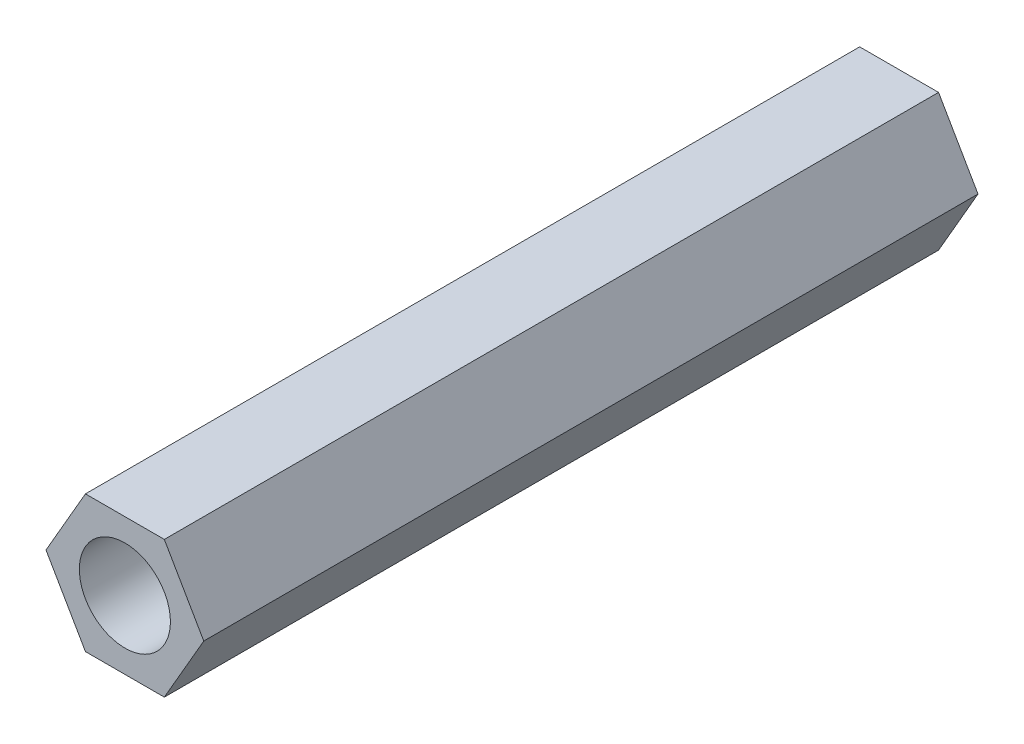
ISO-10303-21;
HEADER;
FILE_DESCRIPTION(('STEP AP214'),'2;1');
FILE_NAME('part.step','',(''),(''),'','','');
FILE_SCHEMA(('AUTOMOTIVE_DESIGN { 1 0 10303 214 1 1 1 1 }'));
ENDSEC;
DATA;
#1=APPLICATION_CONTEXT('core data for automotive mechanical design processes');
#2=APPLICATION_PROTOCOL_DEFINITION('international standard','automotive_design',2000,#1);
#3=PRODUCT_CONTEXT('',#1,'mechanical');
#4=PRODUCT('Part','Part','',(#3));
#5=PRODUCT_RELATED_PRODUCT_CATEGORY('part','',(#4));
#6=PRODUCT_DEFINITION_FORMATION('','',#4);
#7=PRODUCT_DEFINITION_CONTEXT('part definition',#1,'design');
#8=PRODUCT_DEFINITION('design','',#6,#7);
#9=PRODUCT_DEFINITION_SHAPE('','',#8);
#10=(LENGTH_UNIT() NAMED_UNIT(*) SI_UNIT(.MILLI.,.METRE.));
#11=(NAMED_UNIT(*) PLANE_ANGLE_UNIT() SI_UNIT($,.RADIAN.));
#12=(NAMED_UNIT(*) SI_UNIT($,.STERADIAN.) SOLID_ANGLE_UNIT());
#13=UNCERTAINTY_MEASURE_WITH_UNIT(LENGTH_MEASURE(1.E-05),#10,'distance_accuracy_value','');
#14=(GEOMETRIC_REPRESENTATION_CONTEXT(3) GLOBAL_UNCERTAINTY_ASSIGNED_CONTEXT((#13)) GLOBAL_UNIT_ASSIGNED_CONTEXT((#10,
#11,#12)) REPRESENTATION_CONTEXT('',''));
#15=CARTESIAN_POINT('',(0.,0.,0.));
#16=DIRECTION('',(0.,0.,1.));
#17=DIRECTION('',(1.,0.,0.));
#18=AXIS2_PLACEMENT_3D('',#15,#16,#17);
#19=CARTESIAN_POINT('',(0.,0.,17.));
#20=DIRECTION('',(0.,0.,1.));
#21=DIRECTION('',(1.,0.,0.));
#22=AXIS2_PLACEMENT_3D('',#19,#20,#21);
#23=PLANE('',#22);
#24=DIRECTION('',(0.5,0.866025403784438,0.));
#25=VECTOR('',#24,1.);
#26=CARTESIAN_POINT('',(0.86602540378444,-1.5,17.));
#27=LINE('',#26,#25);
#28=CARTESIAN_POINT('',(0.86602540378444,-1.5,17.));
#29=VERTEX_POINT('',#28);
#30=CARTESIAN_POINT('',(1.73205080756888,0.,17.));
#31=VERTEX_POINT('',#30);
#32=EDGE_CURVE('E146',#29,#31,#27,.T.);
#33=ORIENTED_EDGE('',*,*,#32,.T.);
#34=DIRECTION('',(-0.5,0.866025403784438,0.));
#35=VECTOR('',#34,1.);
#36=CARTESIAN_POINT('',(1.73205080756888,0.,17.));
#37=LINE('',#36,#35);
#38=CARTESIAN_POINT('',(0.866025403784438,1.5,17.));
#39=VERTEX_POINT('',#38);
#40=EDGE_CURVE('E94',#31,#39,#37,.T.);
#41=ORIENTED_EDGE('',*,*,#40,.T.);
#42=DIRECTION('',(-1.,0.,0.));
#43=VECTOR('',#42,1.);
#44=CARTESIAN_POINT('',(0.866025403784438,1.5,17.));
#45=LINE('',#44,#43);
#46=CARTESIAN_POINT('',(-0.866025403784439,1.5,17.));
#47=VERTEX_POINT('',#46);
#48=EDGE_CURVE('E107',#39,#47,#45,.T.);
#49=ORIENTED_EDGE('',*,*,#48,.T.);
#50=DIRECTION('',(-0.5,-0.866025403784438,0.));
#51=VECTOR('',#50,1.);
#52=CARTESIAN_POINT('',(-0.866025403784439,1.5,17.));
#53=LINE('',#52,#51);
#54=CARTESIAN_POINT('',(-1.73205080756888,0.,17.));
#55=VERTEX_POINT('',#54);
#56=EDGE_CURVE('E101',#47,#55,#53,.T.);
#57=ORIENTED_EDGE('',*,*,#56,.T.);
#58=DIRECTION('',(0.5,-0.866025403784438,0.));
#59=VECTOR('',#58,1.);
#60=CARTESIAN_POINT('',(-1.73205080756888,0.,17.));
#61=LINE('',#60,#59);
#62=CARTESIAN_POINT('',(-0.866025403784439,-1.5,17.));
#63=VERTEX_POINT('',#62);
#64=EDGE_CURVE('E105',#55,#63,#61,.T.);
#65=ORIENTED_EDGE('',*,*,#64,.T.);
#66=DIRECTION('',(1.,0.,0.));
#67=VECTOR('',#66,1.);
#68=CARTESIAN_POINT('',(-0.866025403784439,-1.5,17.));
#69=LINE('',#68,#67);
#70=EDGE_CURVE('E57',#63,#29,#69,.T.);
#71=ORIENTED_EDGE('',*,*,#70,.T.);
#72=EDGE_LOOP('',(#33,#41,#49,#57,#65,#71));
#73=FACE_BOUND('',#72,.T.);
#74=CARTESIAN_POINT('',(0.,0.,17.));
#75=DIRECTION('',(0.,0.,1.));
#76=DIRECTION('',(1.,0.,0.));
#77=AXIS2_PLACEMENT_3D('',#74,#75,#76);
#78=CIRCLE('',#77,1.);
#79=CARTESIAN_POINT('',(1.,0.,17.));
#80=VERTEX_POINT('',#79);
#81=EDGE_CURVE('E134',#80,#80,#78,.T.);
#82=ORIENTED_EDGE('',*,*,#81,.F.);
#83=EDGE_LOOP('',(#82));
#84=FACE_BOUND('',#83,.T.);
#85=ADVANCED_FACE('F39',(#73,#84),#23,.T.);
#86=CARTESIAN_POINT('',(0.,0.,0.));
#87=DIRECTION('',(0.,0.,1.));
#88=DIRECTION('',(1.,0.,0.));
#89=AXIS2_PLACEMENT_3D('',#86,#87,#88);
#90=PLANE('',#89);
#91=DIRECTION('',(0.5,0.866025403784438,0.));
#92=VECTOR('',#91,1.);
#93=CARTESIAN_POINT('',(0.86602540378444,-1.5,0.));
#94=LINE('',#93,#92);
#95=CARTESIAN_POINT('',(0.86602540378444,-1.5,0.));
#96=VERTEX_POINT('',#95);
#97=CARTESIAN_POINT('',(1.73205080756888,0.,0.));
#98=VERTEX_POINT('',#97);
#99=EDGE_CURVE('E129',#96,#98,#94,.T.);
#100=ORIENTED_EDGE('',*,*,#99,.F.);
#101=DIRECTION('',(1.,0.,0.));
#102=VECTOR('',#101,1.);
#103=CARTESIAN_POINT('',(-0.866025403784439,-1.5,0.));
#104=LINE('',#103,#102);
#105=CARTESIAN_POINT('',(-0.866025403784439,-1.5,0.));
#106=VERTEX_POINT('',#105);
#107=EDGE_CURVE('E86',#106,#96,#104,.T.);
#108=ORIENTED_EDGE('',*,*,#107,.F.);
#109=DIRECTION('',(0.5,-0.866025403784438,0.));
#110=VECTOR('',#109,1.);
#111=CARTESIAN_POINT('',(-1.73205080756888,0.,0.));
#112=LINE('',#111,#110);
#113=CARTESIAN_POINT('',(-1.73205080756888,0.,0.));
#114=VERTEX_POINT('',#113);
#115=EDGE_CURVE('E80',#114,#106,#112,.T.);
#116=ORIENTED_EDGE('',*,*,#115,.F.);
#117=DIRECTION('',(-0.5,-0.866025403784438,0.));
#118=VECTOR('',#117,1.);
#119=CARTESIAN_POINT('',(-0.866025403784439,1.5,0.));
#120=LINE('',#119,#118);
#121=CARTESIAN_POINT('',(-0.866025403784439,1.5,0.));
#122=VERTEX_POINT('',#121);
#123=EDGE_CURVE('E116',#122,#114,#120,.T.);
#124=ORIENTED_EDGE('',*,*,#123,.F.);
#125=DIRECTION('',(-1.,0.,0.));
#126=VECTOR('',#125,1.);
#127=CARTESIAN_POINT('',(0.866025403784438,1.5,0.));
#128=LINE('',#127,#126);
#129=CARTESIAN_POINT('',(0.866025403784438,1.5,0.));
#130=VERTEX_POINT('',#129);
#131=EDGE_CURVE('E137',#130,#122,#128,.T.);
#132=ORIENTED_EDGE('',*,*,#131,.F.);
#133=DIRECTION('',(-0.5,0.866025403784438,0.));
#134=VECTOR('',#133,1.);
#135=CARTESIAN_POINT('',(1.73205080756888,0.,0.));
#136=LINE('',#135,#134);
#137=EDGE_CURVE('E133',#98,#130,#136,.T.);
#138=ORIENTED_EDGE('',*,*,#137,.F.);
#139=EDGE_LOOP('',(#100,#108,#116,#124,#132,#138));
#140=FACE_BOUND('',#139,.T.);
#141=CARTESIAN_POINT('',(0.,0.,0.));
#142=DIRECTION('',(0.,0.,1.));
#143=DIRECTION('',(1.,0.,0.));
#144=AXIS2_PLACEMENT_3D('',#141,#142,#143);
#145=CIRCLE('',#144,1.);
#146=CARTESIAN_POINT('',(1.,0.,0.));
#147=VERTEX_POINT('',#146);
#148=EDGE_CURVE('E243',#147,#147,#145,.T.);
#149=ORIENTED_EDGE('',*,*,#148,.T.);
#150=EDGE_LOOP('',(#149));
#151=FACE_BOUND('',#150,.T.);
#152=ADVANCED_FACE('F159',(#140,#151),#90,.F.);
#153=CARTESIAN_POINT('',(0.86602540378444,-1.5,17.));
#154=DIRECTION('',(-0.866025403784439,0.5,0.));
#155=DIRECTION('',(-0.5,-0.866025403784438,0.));
#156=AXIS2_PLACEMENT_3D('',#153,#154,#155);
#157=PLANE('',#156);
#158=ORIENTED_EDGE('',*,*,#99,.T.);
#159=DIRECTION('',(0.,0.,-1.));
#160=VECTOR('',#159,1.);
#161=CARTESIAN_POINT('',(1.73205080756888,0.,17.));
#162=LINE('',#161,#160);
#163=EDGE_CURVE('E11',#31,#98,#162,.T.);
#164=ORIENTED_EDGE('',*,*,#163,.F.);
#165=ORIENTED_EDGE('',*,*,#32,.F.);
#166=DIRECTION('',(0.,0.,-1.));
#167=VECTOR('',#166,1.);
#168=CARTESIAN_POINT('',(0.86602540378444,-1.5,17.));
#169=LINE('',#168,#167);
#170=EDGE_CURVE('E125',#29,#96,#169,.T.);
#171=ORIENTED_EDGE('',*,*,#170,.T.);
#172=EDGE_LOOP('',(#158,#164,#165,#171));
#173=FACE_BOUND('',#172,.T.);
#174=ADVANCED_FACE('F41',(#173),#157,.F.);
#175=CARTESIAN_POINT('',(1.73205080756888,0.,17.));
#176=DIRECTION('',(-0.866025403784438,-0.5,0.));
#177=DIRECTION('',(0.5,-0.866025403784438,0.));
#178=AXIS2_PLACEMENT_3D('',#175,#176,#177);
#179=PLANE('',#178);
#180=ORIENTED_EDGE('',*,*,#137,.T.);
#181=DIRECTION('',(0.,0.,-1.));
#182=VECTOR('',#181,1.);
#183=CARTESIAN_POINT('',(0.866025403784438,1.5,17.));
#184=LINE('',#183,#182);
#185=EDGE_CURVE('E49',#39,#130,#184,.T.);
#186=ORIENTED_EDGE('',*,*,#185,.F.);
#187=ORIENTED_EDGE('',*,*,#40,.F.);
#188=ORIENTED_EDGE('',*,*,#163,.T.);
#189=EDGE_LOOP('',(#180,#186,#187,#188));
#190=FACE_BOUND('',#189,.T.);
#191=ADVANCED_FACE('F184',(#190),#179,.F.);
#192=CARTESIAN_POINT('',(0.866025403784438,1.5,17.));
#193=DIRECTION('',(0.,-1.,0.));
#194=DIRECTION('',(1.,0.,0.));
#195=AXIS2_PLACEMENT_3D('',#192,#193,#194);
#196=PLANE('',#195);
#197=ORIENTED_EDGE('',*,*,#131,.T.);
#198=DIRECTION('',(0.,0.,-1.));
#199=VECTOR('',#198,1.);
#200=CARTESIAN_POINT('',(-0.866025403784439,1.5,17.));
#201=LINE('',#200,#199);
#202=EDGE_CURVE('E118',#47,#122,#201,.T.);
#203=ORIENTED_EDGE('',*,*,#202,.F.);
#204=ORIENTED_EDGE('',*,*,#48,.F.);
#205=ORIENTED_EDGE('',*,*,#185,.T.);
#206=EDGE_LOOP('',(#197,#203,#204,#205));
#207=FACE_BOUND('',#206,.T.);
#208=ADVANCED_FACE('F156',(#207),#196,.F.);
#209=CARTESIAN_POINT('',(-0.866025403784439,1.5,17.));
#210=DIRECTION('',(0.866025403784439,-0.5,0.));
#211=DIRECTION('',(0.5,0.866025403784438,0.));
#212=AXIS2_PLACEMENT_3D('',#209,#210,#211);
#213=PLANE('',#212);
#214=ORIENTED_EDGE('',*,*,#123,.T.);
#215=DIRECTION('',(0.,0.,-1.));
#216=VECTOR('',#215,1.);
#217=CARTESIAN_POINT('',(-1.73205080756888,0.,17.));
#218=LINE('',#217,#216);
#219=EDGE_CURVE('E113',#55,#114,#218,.T.);
#220=ORIENTED_EDGE('',*,*,#219,.F.);
#221=ORIENTED_EDGE('',*,*,#56,.F.);
#222=ORIENTED_EDGE('',*,*,#202,.T.);
#223=EDGE_LOOP('',(#214,#220,#221,#222));
#224=FACE_BOUND('',#223,.T.);
#225=ADVANCED_FACE('F114',(#224),#213,.F.);
#226=CARTESIAN_POINT('',(-1.73205080756888,0.,17.));
#227=DIRECTION('',(0.866025403784438,0.5,0.));
#228=DIRECTION('',(-0.5,0.866025403784438,0.));
#229=AXIS2_PLACEMENT_3D('',#226,#227,#228);
#230=PLANE('',#229);
#231=ORIENTED_EDGE('',*,*,#115,.T.);
#232=DIRECTION('',(0.,0.,-1.));
#233=VECTOR('',#232,1.);
#234=CARTESIAN_POINT('',(-0.866025403784439,-1.5,17.));
#235=LINE('',#234,#233);
#236=EDGE_CURVE('E119',#63,#106,#235,.T.);
#237=ORIENTED_EDGE('',*,*,#236,.F.);
#238=ORIENTED_EDGE('',*,*,#64,.F.);
#239=ORIENTED_EDGE('',*,*,#219,.T.);
#240=EDGE_LOOP('',(#231,#237,#238,#239));
#241=FACE_BOUND('',#240,.T.);
#242=ADVANCED_FACE('F121',(#241),#230,.F.);
#243=CARTESIAN_POINT('',(-0.866025403784439,-1.5,17.));
#244=DIRECTION('',(0.,1.,0.));
#245=DIRECTION('',(-1.,0.,0.));
#246=AXIS2_PLACEMENT_3D('',#243,#244,#245);
#247=PLANE('',#246);
#248=ORIENTED_EDGE('',*,*,#107,.T.);
#249=ORIENTED_EDGE('',*,*,#170,.F.);
#250=ORIENTED_EDGE('',*,*,#70,.F.);
#251=ORIENTED_EDGE('',*,*,#236,.T.);
#252=EDGE_LOOP('',(#248,#249,#250,#251));
#253=FACE_BOUND('',#252,.T.);
#254=ADVANCED_FACE('F164',(#253),#247,.F.);
#255=CARTESIAN_POINT('',(0.,0.,17.));
#256=DIRECTION('',(0.,0.,-1.));
#257=DIRECTION('',(-1.,0.,0.));
#258=AXIS2_PLACEMENT_3D('',#255,#256,#257);
#259=CYLINDRICAL_SURFACE('',#258,1.);
#260=ORIENTED_EDGE('',*,*,#81,.T.);
#261=EDGE_LOOP('',(#260));
#262=FACE_BOUND('',#261,.T.);
#263=ORIENTED_EDGE('',*,*,#148,.F.);
#264=EDGE_LOOP('',(#263));
#265=FACE_BOUND('',#264,.T.);
#266=ADVANCED_FACE('F166',(#262,#265),#259,.F.);
#267=CLOSED_SHELL('',(#85,#152,#174,#191,#208,#225,#242,#254,#266));
#268=MANIFOLD_SOLID_BREP('B2',#267);
#269=ADVANCED_BREP_SHAPE_REPRESENTATION('',(#18,#268),#14);
#270=SHAPE_DEFINITION_REPRESENTATION(#9,#269);
ENDSEC;
END-ISO-10303-21;
